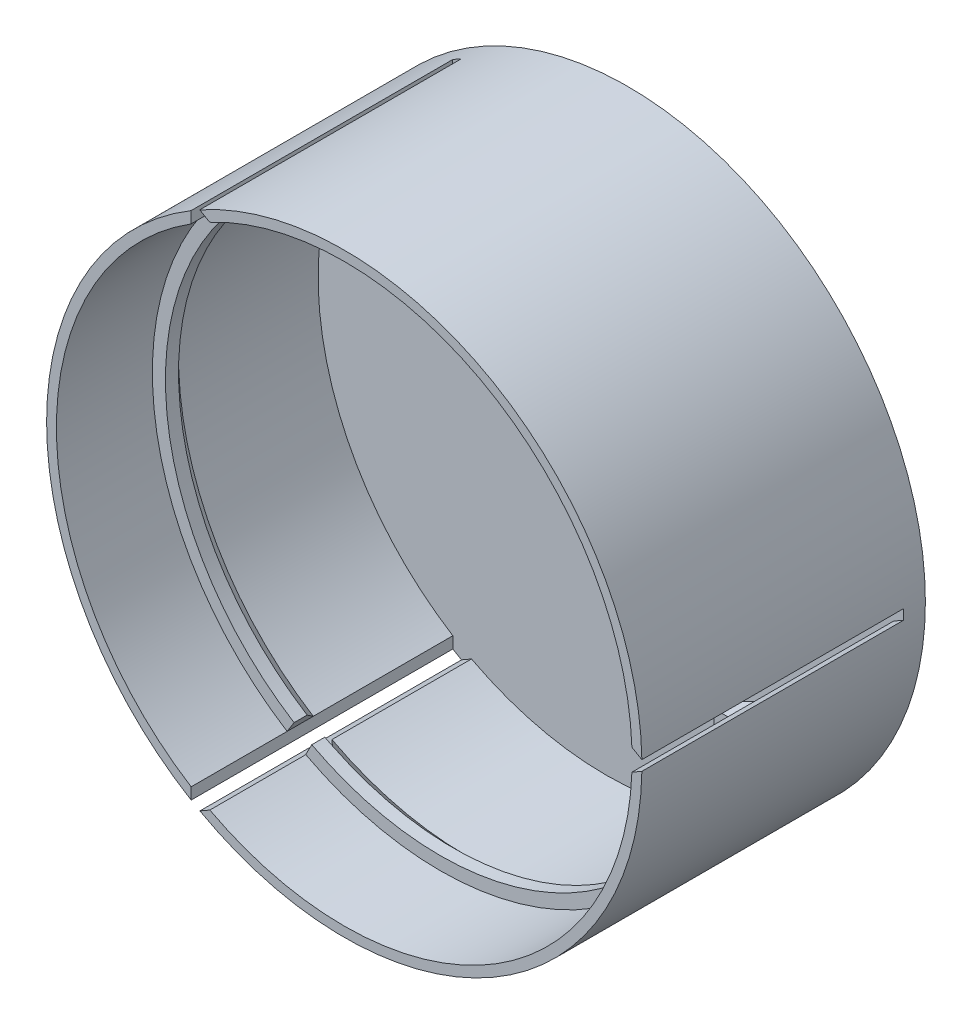
ISO-10303-21;
HEADER;
FILE_DESCRIPTION(('STEP AP214'),'2;1');
FILE_NAME('part.step','',(''),(''),'','','');
FILE_SCHEMA(('AUTOMOTIVE_DESIGN { 1 0 10303 214 1 1 1 1 }'));
ENDSEC;
DATA;
#1=APPLICATION_CONTEXT('core data for automotive mechanical design processes');
#2=APPLICATION_PROTOCOL_DEFINITION('international standard','automotive_design',2000,#1);
#3=PRODUCT_CONTEXT('',#1,'mechanical');
#4=PRODUCT('Part','Part','',(#3));
#5=PRODUCT_RELATED_PRODUCT_CATEGORY('part','',(#4));
#6=PRODUCT_DEFINITION_FORMATION('','',#4);
#7=PRODUCT_DEFINITION_CONTEXT('part definition',#1,'design');
#8=PRODUCT_DEFINITION('design','',#6,#7);
#9=PRODUCT_DEFINITION_SHAPE('','',#8);
#10=(LENGTH_UNIT() NAMED_UNIT(*) SI_UNIT(.MILLI.,.METRE.));
#11=(NAMED_UNIT(*) PLANE_ANGLE_UNIT() SI_UNIT($,.RADIAN.));
#12=(NAMED_UNIT(*) SI_UNIT($,.STERADIAN.) SOLID_ANGLE_UNIT());
#13=UNCERTAINTY_MEASURE_WITH_UNIT(LENGTH_MEASURE(1.E-05),#10,'distance_accuracy_value','');
#14=(GEOMETRIC_REPRESENTATION_CONTEXT(3) GLOBAL_UNCERTAINTY_ASSIGNED_CONTEXT((#13)) GLOBAL_UNIT_ASSIGNED_CONTEXT((#10,
#11,#12)) REPRESENTATION_CONTEXT('',''));
#15=CARTESIAN_POINT('',(0.,0.,0.));
#16=DIRECTION('',(0.,0.,1.));
#17=DIRECTION('',(1.,0.,0.));
#18=AXIS2_PLACEMENT_3D('',#15,#16,#17);
#19=CARTESIAN_POINT('',(0.,0.,-5.));
#20=DIRECTION('',(0.,0.,1.));
#21=DIRECTION('',(1.,0.,0.));
#22=AXIS2_PLACEMENT_3D('',#19,#20,#21);
#23=CYLINDRICAL_SURFACE('',#22,66.);
#24=DIRECTION('',(0.,0.,1.));
#25=VECTOR('',#24,1.);
#26=CARTESIAN_POINT('',(-30.8219729506805,-58.3609971078932,-5.));
#27=LINE('',#26,#25);
#28=CARTESIAN_POINT('',(-30.8219729506805,-58.3609971078932,-5.));
#29=VERTEX_POINT('',#28);
#30=CARTESIAN_POINT('',(-30.8219729506805,-58.3609971078932,27.));
#31=VERTEX_POINT('',#30);
#32=EDGE_CURVE('E397',#29,#31,#27,.T.);
#33=ORIENTED_EDGE('',*,*,#32,.T.);
#34=CARTESIAN_POINT('',(0.,0.,27.));
#35=DIRECTION('',(0.,0.,1.));
#36=DIRECTION('',(1.,0.,0.));
#37=AXIS2_PLACEMENT_3D('',#34,#35,#36);
#38=CIRCLE('',#37,66.);
#39=CARTESIAN_POINT('',(65.9542093795676,-2.45810193363761,27.));
#40=VERTEX_POINT('',#39);
#41=EDGE_CURVE('E465',#31,#40,#38,.T.);
#42=ORIENTED_EDGE('',*,*,#41,.T.);
#43=DIRECTION('',(0.,0.,1.));
#44=VECTOR('',#43,1.);
#45=CARTESIAN_POINT('',(65.9542093795676,-2.45810193363761,-5.));
#46=LINE('',#45,#44);
#47=CARTESIAN_POINT('',(65.9542093795676,-2.45810193363761,-5.));
#48=VERTEX_POINT('',#47);
#49=EDGE_CURVE('E391',#48,#40,#46,.T.);
#50=ORIENTED_EDGE('',*,*,#49,.F.);
#51=CARTESIAN_POINT('',(0.,0.,-5.));
#52=DIRECTION('',(0.,0.,1.));
#53=DIRECTION('',(1.,0.,0.));
#54=AXIS2_PLACEMENT_3D('',#51,#52,#53);
#55=CIRCLE('',#54,66.);
#56=EDGE_CURVE('E367',#29,#48,#55,.T.);
#57=ORIENTED_EDGE('',*,*,#56,.F.);
#58=EDGE_LOOP('',(#33,#42,#50,#57));
#59=FACE_BOUND('',#58,.T.);
#60=ADVANCED_FACE('F45',(#59),#23,.F.);
#61=CARTESIAN_POINT('',(0.,0.,-5.));
#62=DIRECTION('',(0.,0.,1.));
#63=DIRECTION('',(1.,0.,0.));
#64=AXIS2_PLACEMENT_3D('',#61,#62,#63);
#65=CYLINDRICAL_SURFACE('',#64,66.);
#66=DIRECTION('',(0.,0.,1.));
#67=VECTOR('',#66,1.);
#68=CARTESIAN_POINT('',(-35.1311196102854,55.8731101239928,-5.));
#69=LINE('',#68,#67);
#70=CARTESIAN_POINT('',(-35.1311196102854,55.8731101239928,-5.));
#71=VERTEX_POINT('',#70);
#72=CARTESIAN_POINT('',(-35.1311196102854,55.8731101239928,27.));
#73=VERTEX_POINT('',#72);
#74=EDGE_CURVE('E408',#71,#73,#69,.T.);
#75=ORIENTED_EDGE('',*,*,#74,.T.);
#76=CARTESIAN_POINT('',(0.,0.,27.));
#77=DIRECTION('',(0.,0.,1.));
#78=DIRECTION('',(1.,0.,0.));
#79=AXIS2_PLACEMENT_3D('',#76,#77,#78);
#80=CIRCLE('',#79,66.);
#81=CARTESIAN_POINT('',(-35.1058834094056,-55.8889698424047,27.));
#82=VERTEX_POINT('',#81);
#83=EDGE_CURVE('E476',#73,#82,#80,.T.);
#84=ORIENTED_EDGE('',*,*,#83,.T.);
#85=DIRECTION('',(0.,0.,1.));
#86=VECTOR('',#85,1.);
#87=CARTESIAN_POINT('',(-35.1058834094056,-55.8889698424047,-5.));
#88=LINE('',#87,#86);
#89=CARTESIAN_POINT('',(-35.1058834094056,-55.8889698424047,-5.));
#90=VERTEX_POINT('',#89);
#91=EDGE_CURVE('E403',#90,#82,#88,.T.);
#92=ORIENTED_EDGE('',*,*,#91,.F.);
#93=CARTESIAN_POINT('',(0.,0.,-5.));
#94=DIRECTION('',(0.,0.,1.));
#95=DIRECTION('',(1.,0.,0.));
#96=AXIS2_PLACEMENT_3D('',#93,#94,#95);
#97=CIRCLE('',#96,66.);
#98=EDGE_CURVE('E356',#71,#90,#97,.T.);
#99=ORIENTED_EDGE('',*,*,#98,.F.);
#100=EDGE_LOOP('',(#75,#84,#92,#99));
#101=FACE_BOUND('',#100,.T.);
#102=ADVANCED_FACE('F566',(#101),#65,.F.);
#103=CARTESIAN_POINT('',(0.,0.,-5.));
#104=DIRECTION('',(0.,0.,1.));
#105=DIRECTION('',(1.,0.,0.));
#106=AXIS2_PLACEMENT_3D('',#103,#104,#105);
#107=CYLINDRICAL_SURFACE('',#106,66.);
#108=DIRECTION('',(0.,0.,1.));
#109=VECTOR('',#108,1.);
#110=CARTESIAN_POINT('',(65.9530925609659,2.48788698390048,-5.));
#111=LINE('',#110,#109);
#112=CARTESIAN_POINT('',(65.9530925609659,2.48788698390048,-5.));
#113=VERTEX_POINT('',#112);
#114=CARTESIAN_POINT('',(65.9530925609659,2.48788698390048,27.));
#115=VERTEX_POINT('',#114);
#116=EDGE_CURVE('E417',#113,#115,#111,.T.);
#117=ORIENTED_EDGE('',*,*,#116,.T.);
#118=CARTESIAN_POINT('',(0.,0.,27.));
#119=DIRECTION('',(0.,0.,1.));
#120=DIRECTION('',(1.,0.,0.));
#121=AXIS2_PLACEMENT_3D('',#118,#119,#120);
#122=CIRCLE('',#121,66.);
#123=CARTESIAN_POINT('',(-30.848325970162,58.3470717760423,27.));
#124=VERTEX_POINT('',#123);
#125=EDGE_CURVE('E472',#115,#124,#122,.T.);
#126=ORIENTED_EDGE('',*,*,#125,.T.);
#127=DIRECTION('',(0.,0.,1.));
#128=VECTOR('',#127,1.);
#129=CARTESIAN_POINT('',(-30.848325970162,58.3470717760423,-5.));
#130=LINE('',#129,#128);
#131=CARTESIAN_POINT('',(-30.848325970162,58.3470717760423,-5.));
#132=VERTEX_POINT('',#131);
#133=EDGE_CURVE('E412',#132,#124,#130,.T.);
#134=ORIENTED_EDGE('',*,*,#133,.F.);
#135=CARTESIAN_POINT('',(0.,0.,-5.));
#136=DIRECTION('',(0.,0.,1.));
#137=DIRECTION('',(1.,0.,0.));
#138=AXIS2_PLACEMENT_3D('',#135,#136,#137);
#139=CIRCLE('',#138,66.);
#140=EDGE_CURVE('E345',#113,#132,#139,.T.);
#141=ORIENTED_EDGE('',*,*,#140,.F.);
#142=EDGE_LOOP('',(#117,#126,#134,#141));
#143=FACE_BOUND('',#142,.T.);
#144=ADVANCED_FACE('F577',(#143),#107,.F.);
#145=CARTESIAN_POINT('',(0.,0.,55.));
#146=DIRECTION('',(0.,0.,1.));
#147=DIRECTION('',(1.,0.,0.));
#148=AXIS2_PLACEMENT_3D('',#145,#146,#147);
#149=PLANE('',#148);
#150=DIRECTION('',(0.86591248026329,0.500195538289056,0.));
#151=VECTOR('',#150,1.);
#152=CARTESIAN_POINT('',(65.9542093795676,-2.45810193363761,55.));
#153=LINE('',#152,#151);
#154=CARTESIAN_POINT('',(65.9542093795676,-2.45810193363761,55.));
#155=VERTEX_POINT('',#154);
#156=CARTESIAN_POINT('',(68.2405216669806,-1.13741048806372,55.));
#157=VERTEX_POINT('',#156);
#158=EDGE_CURVE('E336',#155,#157,#153,.T.);
#159=ORIENTED_EDGE('',*,*,#158,.F.);
#160=CARTESIAN_POINT('',(0.,0.,55.));
#161=DIRECTION('',(0.,0.,1.));
#162=DIRECTION('',(1.,0.,0.));
#163=AXIS2_PLACEMENT_3D('',#160,#161,#162);
#164=CIRCLE('',#163,66.);
#165=CARTESIAN_POINT('',(-30.8219729506805,-58.3609971078932,55.));
#166=VERTEX_POINT('',#165);
#167=EDGE_CURVE('E342',#166,#155,#164,.T.);
#168=ORIENTED_EDGE('',*,*,#167,.F.);
#169=DIRECTION('',(0.865912480263289,0.500195538289057,0.));
#170=VECTOR('',#169,1.);
#171=CARTESIAN_POINT('',(17.5661182144436,-30.4095495207654,55.));
#172=LINE('',#171,#170);
#173=CARTESIAN_POINT('',(-33.1082852380935,-59.6816885534671,55.));
#174=VERTEX_POINT('',#173);
#175=EDGE_CURVE('E455',#174,#166,#172,.T.);
#176=ORIENTED_EDGE('',*,*,#175,.F.);
#177=CARTESIAN_POINT('',(0.,0.,55.));
#178=DIRECTION('',(0.,0.,1.));
#179=DIRECTION('',(1.,0.,0.));
#180=AXIS2_PLACEMENT_3D('',#177,#178,#179);
#181=CIRCLE('',#180,68.25);
#182=EDGE_CURVE('E437',#174,#157,#181,.T.);
#183=ORIENTED_EDGE('',*,*,#182,.T.);
#184=EDGE_LOOP('',(#159,#168,#176,#183));
#185=FACE_BOUND('',#184,.T.);
#186=ADVANCED_FACE('F587',(#185),#149,.T.);
#187=DIRECTION('',(0.000225802886308738,-0.999999974506528,0.));
#188=VECTOR('',#187,1.);
#189=CARTESIAN_POINT('',(-35.1058834094056,-55.8889698424047,55.));
#190=LINE('',#189,#188);
#191=CARTESIAN_POINT('',(-35.1058834094056,-55.8889698424047,55.));
#192=VERTEX_POINT('',#191);
#193=CARTESIAN_POINT('',(-35.1052872106843,-58.5293200870757,55.));
#194=VERTEX_POINT('',#193);
#195=EDGE_CURVE('E385',#192,#194,#190,.T.);
#196=ORIENTED_EDGE('',*,*,#195,.F.);
#197=CARTESIAN_POINT('',(0.,0.,55.));
#198=DIRECTION('',(0.,0.,1.));
#199=DIRECTION('',(1.,0.,0.));
#200=AXIS2_PLACEMENT_3D('',#197,#198,#199);
#201=CIRCLE('',#200,66.);
#202=CARTESIAN_POINT('',(-35.1311196102854,55.8731101239928,55.));
#203=VERTEX_POINT('',#202);
#204=EDGE_CURVE('E381',#203,#192,#201,.T.);
#205=ORIENTED_EDGE('',*,*,#204,.F.);
#206=DIRECTION('',(0.000225802886308739,-0.999999974506528,0.));
#207=VECTOR('',#206,1.);
#208=CARTESIAN_POINT('',(-35.1185015098456,-0.0079298592059206,55.));
#209=LINE('',#208,#207);
#210=CARTESIAN_POINT('',(-35.1317158090067,58.5134603686638,55.));
#211=VERTEX_POINT('',#210);
#212=EDGE_CURVE('E451',#211,#203,#209,.T.);
#213=ORIENTED_EDGE('',*,*,#212,.F.);
#214=EDGE_CURVE('E443',#211,#194,#181,.T.);
#215=ORIENTED_EDGE('',*,*,#214,.T.);
#216=EDGE_LOOP('',(#196,#205,#213,#215));
#217=FACE_BOUND('',#216,.T.);
#218=ADVANCED_FACE('F588',(#217),#149,.T.);
#219=CARTESIAN_POINT('',(0.,0.,-10.));
#220=DIRECTION('',(0.,0.,1.));
#221=DIRECTION('',(1.,0.,0.));
#222=AXIS2_PLACEMENT_3D('',#219,#220,#221);
#223=CYLINDRICAL_SURFACE('',#222,68.25);
#224=DIRECTION('',(0.,0.,1.));
#225=VECTOR('',#224,1.);
#226=CARTESIAN_POINT('',(-33.1082852380935,-59.6816885534671,-10.));
#227=LINE('',#226,#225);
#228=CARTESIAN_POINT('',(-33.1082852380935,-59.6816885534671,-5.));
#229=VERTEX_POINT('',#228);
#230=EDGE_CURVE('E431',#229,#174,#227,.T.);
#231=ORIENTED_EDGE('',*,*,#230,.F.);
#232=CARTESIAN_POINT('',(0.,0.,-5.));
#233=DIRECTION('',(0.,0.,1.));
#234=DIRECTION('',(1.,0.,0.));
#235=AXIS2_PLACEMENT_3D('',#232,#233,#234);
#236=CIRCLE('',#235,68.25);
#237=CARTESIAN_POINT('',(-35.1052872106843,-58.5293200870757,-5.));
#238=VERTEX_POINT('',#237);
#239=EDGE_CURVE('E464',#229,#238,#236,.F.);
#240=ORIENTED_EDGE('',*,*,#239,.T.);
#241=DIRECTION('',(0.,0.,1.));
#242=VECTOR('',#241,1.);
#243=CARTESIAN_POINT('',(-35.1052872106843,-58.5293200870757,-10.));
#244=LINE('',#243,#242);
#245=EDGE_CURVE('E428',#194,#238,#244,.F.);
#246=ORIENTED_EDGE('',*,*,#245,.F.);
#247=ORIENTED_EDGE('',*,*,#214,.F.);
#248=DIRECTION('',(0.,0.,1.));
#249=VECTOR('',#248,1.);
#250=CARTESIAN_POINT('',(-35.1317158090067,58.5134603686638,-10.));
#251=LINE('',#250,#249);
#252=CARTESIAN_POINT('',(-35.1317158090067,58.5134603686638,-5.));
#253=VERTEX_POINT('',#252);
#254=EDGE_CURVE('E425',#253,#211,#251,.T.);
#255=ORIENTED_EDGE('',*,*,#254,.F.);
#256=CARTESIAN_POINT('',(-33.1352344562963,59.6667305751394,-5.));
#257=VERTEX_POINT('',#256);
#258=EDGE_CURVE('E463',#253,#257,#236,.F.);
#259=ORIENTED_EDGE('',*,*,#258,.T.);
#260=DIRECTION('',(0.,0.,1.));
#261=VECTOR('',#260,1.);
#262=CARTESIAN_POINT('',(-33.1352344562963,59.6667305751394,-10.));
#263=LINE('',#262,#261);
#264=CARTESIAN_POINT('',(-33.1352344562963,59.6667305751394,55.));
#265=VERTEX_POINT('',#264);
#266=EDGE_CURVE('E422',#265,#257,#263,.F.);
#267=ORIENTED_EDGE('',*,*,#266,.F.);
#268=CARTESIAN_POINT('',(68.2400010471002,1.16822818480333,55.));
#269=VERTEX_POINT('',#268);
#270=EDGE_CURVE('E438',#269,#265,#181,.T.);
#271=ORIENTED_EDGE('',*,*,#270,.F.);
#272=DIRECTION('',(0.,0.,1.));
#273=VECTOR('',#272,1.);
#274=CARTESIAN_POINT('',(68.2400010471002,1.16822818480333,-10.));
#275=LINE('',#274,#273);
#276=CARTESIAN_POINT('',(68.2400010471002,1.16822818480332,-5.));
#277=VERTEX_POINT('',#276);
#278=EDGE_CURVE('E395',#277,#269,#275,.T.);
#279=ORIENTED_EDGE('',*,*,#278,.F.);
#280=CARTESIAN_POINT('',(68.2405216669806,-1.13741048806372,-5.));
#281=VERTEX_POINT('',#280);
#282=EDGE_CURVE('E459',#277,#281,#236,.F.);
#283=ORIENTED_EDGE('',*,*,#282,.T.);
#284=DIRECTION('',(0.,0.,1.));
#285=VECTOR('',#284,1.);
#286=CARTESIAN_POINT('',(68.2405216669806,-1.13741048806373,-10.));
#287=LINE('',#286,#285);
#288=EDGE_CURVE('E434',#157,#281,#287,.F.);
#289=ORIENTED_EDGE('',*,*,#288,.F.);
#290=ORIENTED_EDGE('',*,*,#182,.F.);
#291=EDGE_LOOP('',(#231,#240,#246,#247,#255,#259,#267,#271,#279,#283,#289,#290));
#292=FACE_BOUND('',#291,.T.);
#293=CARTESIAN_POINT('',(0.,0.,-10.));
#294=DIRECTION('',(0.,0.,1.));
#295=DIRECTION('',(1.,0.,0.));
#296=AXIS2_PLACEMENT_3D('',#293,#294,#295);
#297=CIRCLE('',#296,68.25);
#298=CARTESIAN_POINT('',(68.25,0.,-10.));
#299=VERTEX_POINT('',#298);
#300=EDGE_CURVE('E442',#299,#299,#297,.T.);
#301=ORIENTED_EDGE('',*,*,#300,.T.);
#302=EDGE_LOOP('',(#301));
#303=FACE_BOUND('',#302,.T.);
#304=ADVANCED_FACE('F509',(#292,#303),#223,.T.);
#305=CARTESIAN_POINT('',(0.,0.,-10.));
#306=DIRECTION('',(0.,0.,1.));
#307=DIRECTION('',(1.,0.,0.));
#308=AXIS2_PLACEMENT_3D('',#305,#306,#307);
#309=PLANE('',#308);
#310=ORIENTED_EDGE('',*,*,#300,.F.);
#311=EDGE_LOOP('',(#310));
#312=FACE_BOUND('',#311,.T.);
#313=ADVANCED_FACE('F585',(#312),#309,.F.);
#314=DIRECTION('',(-0.8661382831496,0.49980443621747,0.));
#315=VECTOR('',#314,1.);
#316=CARTESIAN_POINT('',(-30.848325970162,58.3470717760423,55.));
#317=LINE('',#316,#315);
#318=CARTESIAN_POINT('',(-30.848325970162,58.3470717760423,55.));
#319=VERTEX_POINT('',#318);
#320=EDGE_CURVE('E378',#319,#265,#317,.T.);
#321=ORIENTED_EDGE('',*,*,#320,.F.);
#322=CARTESIAN_POINT('',(0.,0.,55.));
#323=DIRECTION('',(0.,0.,1.));
#324=DIRECTION('',(1.,0.,0.));
#325=AXIS2_PLACEMENT_3D('',#322,#323,#324);
#326=CIRCLE('',#325,66.);
#327=CARTESIAN_POINT('',(65.9530925609659,2.48788698390048,55.));
#328=VERTEX_POINT('',#327);
#329=EDGE_CURVE('E374',#328,#319,#326,.T.);
#330=ORIENTED_EDGE('',*,*,#329,.F.);
#331=DIRECTION('',(-0.866138283149599,0.499804436217473,0.));
#332=VECTOR('',#331,1.);
#333=CARTESIAN_POINT('',(17.5523832954021,30.4174793799714,55.));
#334=LINE('',#333,#332);
#335=EDGE_CURVE('E447',#269,#328,#334,.T.);
#336=ORIENTED_EDGE('',*,*,#335,.F.);
#337=ORIENTED_EDGE('',*,*,#270,.T.);
#338=EDGE_LOOP('',(#321,#330,#336,#337));
#339=FACE_BOUND('',#338,.T.);
#340=ADVANCED_FACE('F582',(#339),#149,.T.);
#341=CARTESIAN_POINT('',(65.9542093795676,-2.45810193363761,-5.));
#342=DIRECTION('',(0.500195538289056,-0.86591248026329,0.));
#343=DIRECTION('',(0.86591248026329,0.500195538289056,0.));
#344=AXIS2_PLACEMENT_3D('',#341,#342,#343);
#345=PLANE('',#344);
#346=ORIENTED_EDGE('',*,*,#288,.T.);
#347=DIRECTION('',(0.86591248026329,0.500195538289056,0.));
#348=VECTOR('',#347,1.);
#349=CARTESIAN_POINT('',(65.9542093795676,-2.45810193363761,-5.));
#350=LINE('',#349,#348);
#351=EDGE_CURVE('E337',#48,#281,#350,.T.);
#352=ORIENTED_EDGE('',*,*,#351,.F.);
#353=ORIENTED_EDGE('',*,*,#49,.T.);
#354=DIRECTION('',(0.,0.,-1.));
#355=VECTOR('',#354,1.);
#356=CARTESIAN_POINT('',(65.9542093795676,-2.45810193363761,33.));
#357=LINE('',#356,#355);
#358=CARTESIAN_POINT('',(65.9542093795676,-2.45810193363761,33.));
#359=VERTEX_POINT('',#358);
#360=EDGE_CURVE('E244',#359,#40,#357,.T.);
#361=ORIENTED_EDGE('',*,*,#360,.F.);
#362=EDGE_CURVE('E396',#359,#155,#46,.T.);
#363=ORIENTED_EDGE('',*,*,#362,.T.);
#364=ORIENTED_EDGE('',*,*,#158,.T.);
#365=EDGE_LOOP('',(#346,#352,#353,#361,#363,#364));
#366=FACE_BOUND('',#365,.T.);
#367=ADVANCED_FACE('F551',(#366),#345,.F.);
#368=ORIENTED_EDGE('',*,*,#362,.F.);
#369=CARTESIAN_POINT('',(0.,0.,33.));
#370=DIRECTION('',(0.,0.,1.));
#371=DIRECTION('',(1.,0.,0.));
#372=AXIS2_PLACEMENT_3D('',#369,#370,#371);
#373=CIRCLE('',#372,66.);
#374=CARTESIAN_POINT('',(-30.8219729506806,-58.3609971078932,33.));
#375=VERTEX_POINT('',#374);
#376=EDGE_CURVE('E230',#375,#359,#373,.T.);
#377=ORIENTED_EDGE('',*,*,#376,.F.);
#378=EDGE_CURVE('E402',#375,#166,#27,.T.);
#379=ORIENTED_EDGE('',*,*,#378,.T.);
#380=ORIENTED_EDGE('',*,*,#167,.T.);
#381=EDGE_LOOP('',(#368,#377,#379,#380));
#382=FACE_BOUND('',#381,.T.);
#383=ADVANCED_FACE('F548',(#382),#23,.F.);
#384=CARTESIAN_POINT('',(-35.1047665908039,-60.8349587599427,-5.));
#385=DIRECTION('',(0.500195538289057,-0.865912480263289,0.));
#386=DIRECTION('',(0.865912480263289,0.500195538289057,0.));
#387=AXIS2_PLACEMENT_3D('',#384,#385,#386);
#388=PLANE('',#387);
#389=ORIENTED_EDGE('',*,*,#230,.T.);
#390=ORIENTED_EDGE('',*,*,#175,.T.);
#391=ORIENTED_EDGE('',*,*,#378,.F.);
#392=CARTESIAN_POINT('',(-30.8219729506805,-58.3609971078932,30.));
#393=VERTEX_POINT('',#392);
#394=EDGE_CURVE('E401',#393,#375,#27,.T.);
#395=ORIENTED_EDGE('',*,*,#394,.F.);
#396=DIRECTION('',(-0.865912480263289,-0.500195538289057,0.));
#397=VECTOR('',#396,1.);
#398=CARTESIAN_POINT('',(-35.1047665908039,-60.8349587599427,30.));
#399=LINE('',#398,#397);
#400=CARTESIAN_POINT('',(-27.7244222407029,-56.5716926688536,30.));
#401=VERTEX_POINT('',#400);
#402=EDGE_CURVE('E469',#401,#393,#399,.T.);
#403=ORIENTED_EDGE('',*,*,#402,.F.);
#404=CARTESIAN_POINT('',(-27.7244222407029,-56.5716926688536,30.));
#405=CARTESIAN_POINT('',(-27.9836248621913,-56.7214214205882,29.7514812333899));
#406=CARTESIAN_POINT('',(-28.2425456993128,-56.8709873991948,29.5025706679296));
#407=CARTESIAN_POINT('',(-28.7598429297806,-57.1698048577106,29.0039996660546));
#408=CARTESIAN_POINT('',(-29.0182193262945,-57.3190563394494,28.7543392340232));
#409=CARTESIAN_POINT('',(-29.5344497234988,-57.6172575402593,28.2542994230189));
#410=CARTESIAN_POINT('',(-29.7923037243934,-57.7662072594483,28.003920044327));
#411=CARTESIAN_POINT('',(-30.3075101228951,-58.0638169459955,27.5024704113316));
#412=CARTESIAN_POINT('',(-30.5648625175671,-58.2124769116584,27.2514001530063));
#413=CARTESIAN_POINT('',(-30.8219729506805,-58.3609971078932,27.));
#414=B_SPLINE_CURVE_WITH_KNOTS('',3,(#404,#405,#406,#407,#408,#409,#410,#411,#412,#413),
.UNSPECIFIED.,.F.,.F.,(4,2,2,2,4),(0.,1.1671740831421,2.33434135710061,3.50150817501488,
4.668681801875),.UNSPECIFIED.);
#415=EDGE_CURVE('E488',#401,#31,#414,.T.);
#416=ORIENTED_EDGE('',*,*,#415,.T.);
#417=ORIENTED_EDGE('',*,*,#32,.F.);
#418=DIRECTION('',(0.865912480263289,0.500195538289057,0.));
#419=VECTOR('',#418,1.);
#420=CARTESIAN_POINT('',(-35.1047665908039,-60.8349587599427,-5.));
#421=LINE('',#420,#419);
#422=EDGE_CURVE('E364',#229,#29,#421,.T.);
#423=ORIENTED_EDGE('',*,*,#422,.F.);
#424=EDGE_LOOP('',(#389,#390,#391,#395,#403,#416,#417,#423));
#425=FACE_BOUND('',#424,.T.);
#426=ADVANCED_FACE('F550',(#425),#388,.F.);
#427=CARTESIAN_POINT('',(-35.1058834094056,-55.8889698424047,-5.));
#428=DIRECTION('',(-0.999999974506528,-0.000225802886308738,0.));
#429=DIRECTION('',(0.000225802886308738,-0.999999974506528,0.));
#430=AXIS2_PLACEMENT_3D('',#427,#428,#429);
#431=PLANE('',#430);
#432=ORIENTED_EDGE('',*,*,#245,.T.);
#433=DIRECTION('',(0.000225802886308738,-0.999999974506528,0.));
#434=VECTOR('',#433,1.);
#435=CARTESIAN_POINT('',(-35.1058834094056,-55.8889698424047,-5.));
#436=LINE('',#435,#434);
#437=EDGE_CURVE('E360',#90,#238,#436,.T.);
#438=ORIENTED_EDGE('',*,*,#437,.F.);
#439=ORIENTED_EDGE('',*,*,#91,.T.);
#440=DIRECTION('',(0.,0.,-1.));
#441=VECTOR('',#440,1.);
#442=CARTESIAN_POINT('',(-35.1058834094056,-55.8889698424047,33.));
#443=LINE('',#442,#441);
#444=CARTESIAN_POINT('',(-35.1058834094056,-55.8889698424047,33.));
#445=VERTEX_POINT('',#444);
#446=EDGE_CURVE('E303',#445,#82,#443,.T.);
#447=ORIENTED_EDGE('',*,*,#446,.F.);
#448=EDGE_CURVE('E407',#445,#192,#88,.T.);
#449=ORIENTED_EDGE('',*,*,#448,.T.);
#450=ORIENTED_EDGE('',*,*,#195,.T.);
#451=EDGE_LOOP('',(#432,#438,#439,#447,#449,#450));
#452=FACE_BOUND('',#451,.T.);
#453=ADVANCED_FACE('F556',(#452),#431,.F.);
#454=ORIENTED_EDGE('',*,*,#448,.F.);
#455=CARTESIAN_POINT('',(0.,0.,33.));
#456=DIRECTION('',(0.,0.,1.));
#457=DIRECTION('',(1.,0.,0.));
#458=AXIS2_PLACEMENT_3D('',#455,#456,#457);
#459=CIRCLE('',#458,66.);
#460=CARTESIAN_POINT('',(-35.1311196102854,55.8731101239928,33.));
#461=VERTEX_POINT('',#460);
#462=EDGE_CURVE('E277',#461,#445,#459,.T.);
#463=ORIENTED_EDGE('',*,*,#462,.F.);
#464=EDGE_CURVE('E411',#461,#203,#69,.T.);
#465=ORIENTED_EDGE('',*,*,#464,.T.);
#466=ORIENTED_EDGE('',*,*,#204,.T.);
#467=EDGE_LOOP('',(#454,#463,#465,#466));
#468=FACE_BOUND('',#467,.T.);
#469=ADVANCED_FACE('F560',(#468),#65,.F.);
#470=CARTESIAN_POINT('',(-35.1322364288871,60.8190990415308,-5.));
#471=DIRECTION('',(-0.999999974506528,-0.000225802886308739,0.));
#472=DIRECTION('',(0.000225802886308739,-0.999999974506528,0.));
#473=AXIS2_PLACEMENT_3D('',#470,#471,#472);
#474=PLANE('',#473);
#475=ORIENTED_EDGE('',*,*,#254,.T.);
#476=ORIENTED_EDGE('',*,*,#212,.T.);
#477=ORIENTED_EDGE('',*,*,#464,.F.);
#478=DIRECTION('',(0.,0.,-1.));
#479=VECTOR('',#478,1.);
#480=CARTESIAN_POINT('',(-35.1311196102854,55.8731101239928,33.));
#481=LINE('',#480,#479);
#482=EDGE_CURVE('E62',#461,#73,#481,.T.);
#483=ORIENTED_EDGE('',*,*,#482,.T.);
#484=ORIENTED_EDGE('',*,*,#74,.F.);
#485=DIRECTION('',(0.000225802886308739,-0.999999974506528,0.));
#486=VECTOR('',#485,1.);
#487=CARTESIAN_POINT('',(-35.1322364288871,60.8190990415308,-5.));
#488=LINE('',#487,#486);
#489=EDGE_CURVE('E353',#253,#71,#488,.T.);
#490=ORIENTED_EDGE('',*,*,#489,.F.);
#491=EDGE_LOOP('',(#475,#476,#477,#483,#484,#490));
#492=FACE_BOUND('',#491,.T.);
#493=ADVANCED_FACE('F564',(#492),#474,.F.);
#494=CARTESIAN_POINT('',(-30.848325970162,58.3470717760423,-5.));
#495=DIRECTION('',(0.49980443621747,0.8661382831496,0.));
#496=DIRECTION('',(-0.8661382831496,0.49980443621747,0.));
#497=AXIS2_PLACEMENT_3D('',#494,#495,#496);
#498=PLANE('',#497);
#499=ORIENTED_EDGE('',*,*,#266,.T.);
#500=DIRECTION('',(-0.8661382831496,0.49980443621747,0.));
#501=VECTOR('',#500,1.);
#502=CARTESIAN_POINT('',(-30.848325970162,58.3470717760423,-5.));
#503=LINE('',#502,#501);
#504=EDGE_CURVE('E349',#132,#257,#503,.T.);
#505=ORIENTED_EDGE('',*,*,#504,.F.);
#506=ORIENTED_EDGE('',*,*,#133,.T.);
#507=DIRECTION('',(0.,0.,-1.));
#508=VECTOR('',#507,1.);
#509=CARTESIAN_POINT('',(-30.848325970162,58.3470717760423,33.));
#510=LINE('',#509,#508);
#511=CARTESIAN_POINT('',(-30.848325970162,58.3470717760423,33.));
#512=VERTEX_POINT('',#511);
#513=EDGE_CURVE('E333',#512,#124,#510,.T.);
#514=ORIENTED_EDGE('',*,*,#513,.F.);
#515=EDGE_CURVE('E416',#512,#319,#130,.T.);
#516=ORIENTED_EDGE('',*,*,#515,.T.);
#517=ORIENTED_EDGE('',*,*,#320,.T.);
#518=EDGE_LOOP('',(#499,#505,#506,#514,#516,#517));
#519=FACE_BOUND('',#518,.T.);
#520=ADVANCED_FACE('F569',(#519),#498,.F.);
#521=ORIENTED_EDGE('',*,*,#515,.F.);
#522=CARTESIAN_POINT('',(0.,0.,33.));
#523=DIRECTION('',(0.,0.,1.));
#524=DIRECTION('',(1.,0.,0.));
#525=AXIS2_PLACEMENT_3D('',#522,#523,#524);
#526=CIRCLE('',#525,66.);
#527=CARTESIAN_POINT('',(65.9530925609659,2.48788698390048,33.));
#528=VERTEX_POINT('',#527);
#529=EDGE_CURVE('E307',#528,#512,#526,.T.);
#530=ORIENTED_EDGE('',*,*,#529,.F.);
#531=EDGE_CURVE('E371',#528,#328,#111,.T.);
#532=ORIENTED_EDGE('',*,*,#531,.T.);
#533=ORIENTED_EDGE('',*,*,#329,.T.);
#534=EDGE_LOOP('',(#521,#530,#532,#533));
#535=FACE_BOUND('',#534,.T.);
#536=ADVANCED_FACE('F572',(#535),#107,.F.);
#537=CARTESIAN_POINT('',(70.2370030196911,0.0158597184119298,-5.));
#538=DIRECTION('',(0.499804436217473,0.866138283149599,0.));
#539=DIRECTION('',(-0.866138283149599,0.499804436217473,0.));
#540=AXIS2_PLACEMENT_3D('',#537,#538,#539);
#541=PLANE('',#540);
#542=ORIENTED_EDGE('',*,*,#278,.T.);
#543=ORIENTED_EDGE('',*,*,#335,.T.);
#544=ORIENTED_EDGE('',*,*,#531,.F.);
#545=DIRECTION('',(0.,0.,-1.));
#546=VECTOR('',#545,1.);
#547=CARTESIAN_POINT('',(65.9530925609659,2.48788698390048,33.));
#548=LINE('',#547,#546);
#549=EDGE_CURVE('E71',#528,#115,#548,.T.);
#550=ORIENTED_EDGE('',*,*,#549,.T.);
#551=ORIENTED_EDGE('',*,*,#116,.F.);
#552=DIRECTION('',(-0.866138283149598,0.499804436217473,0.));
#553=VECTOR('',#552,1.);
#554=CARTESIAN_POINT('',(70.2370030196911,0.0158597184119298,-5.));
#555=LINE('',#554,#553);
#556=EDGE_CURVE('E341',#277,#113,#555,.T.);
#557=ORIENTED_EDGE('',*,*,#556,.F.);
#558=EDGE_LOOP('',(#542,#543,#544,#550,#551,#557));
#559=FACE_BOUND('',#558,.T.);
#560=ADVANCED_FACE('F546',(#559),#541,.F.);
#561=CARTESIAN_POINT('',(0.,0.,-5.));
#562=DIRECTION('',(0.,0.,1.));
#563=DIRECTION('',(1.,0.,0.));
#564=AXIS2_PLACEMENT_3D('',#561,#562,#563);
#565=PLANE('',#564);
#566=ORIENTED_EDGE('',*,*,#422,.T.);
#567=ORIENTED_EDGE('',*,*,#56,.T.);
#568=ORIENTED_EDGE('',*,*,#351,.T.);
#569=ORIENTED_EDGE('',*,*,#282,.F.);
#570=ORIENTED_EDGE('',*,*,#556,.T.);
#571=ORIENTED_EDGE('',*,*,#140,.T.);
#572=ORIENTED_EDGE('',*,*,#504,.T.);
#573=ORIENTED_EDGE('',*,*,#258,.F.);
#574=ORIENTED_EDGE('',*,*,#489,.T.);
#575=ORIENTED_EDGE('',*,*,#98,.T.);
#576=ORIENTED_EDGE('',*,*,#437,.T.);
#577=ORIENTED_EDGE('',*,*,#239,.F.);
#578=EDGE_LOOP('',(#566,#567,#568,#569,#570,#571,#572,#573,#574,#575,#576,#577));
#579=FACE_BOUND('',#578,.T.);
#580=ADVANCED_FACE('F542',(#579),#565,.T.);
#581=CARTESIAN_POINT('',(-30.848325970162,58.3470717760423,33.));
#582=DIRECTION('',(0.884046542061247,0.467398878335787,0.));
#583=DIRECTION('',(-0.467398878335787,0.884046542061247,0.));
#584=AXIS2_PLACEMENT_3D('',#581,#582,#583);
#585=PLANE('',#584);
#586=ORIENTED_EDGE('',*,*,#513,.T.);
#587=DIRECTION('',(0.330500916390221,-0.625115304776027,0.707106781186547));
#588=VECTOR('',#587,1.);
#589=CARTESIAN_POINT('',(0.,0.,92.9999999999999));
#590=LINE('',#589,#588);
#591=CARTESIAN_POINT('',(-29.4461293351547,55.6949321498585,30.));
#592=VERTEX_POINT('',#591);
#593=EDGE_CURVE('E526',#124,#592,#590,.T.);
#594=ORIENTED_EDGE('',*,*,#593,.T.);
#595=DIRECTION('',(0.,0.,-1.));
#596=VECTOR('',#595,1.);
#597=CARTESIAN_POINT('',(-29.4461293351547,55.6949321498585,33.));
#598=LINE('',#597,#596);
#599=CARTESIAN_POINT('',(-29.4461293351547,55.6949321498585,33.));
#600=VERTEX_POINT('',#599);
#601=EDGE_CURVE('E329',#600,#592,#598,.T.);
#602=ORIENTED_EDGE('',*,*,#601,.F.);
#603=DIRECTION('',(0.467398878335787,-0.884046542061247,0.));
#604=VECTOR('',#603,1.);
#605=CARTESIAN_POINT('',(-30.848325970162,58.3470717760423,33.));
#606=LINE('',#605,#604);
#607=EDGE_CURVE('E311',#512,#600,#606,.T.);
#608=ORIENTED_EDGE('',*,*,#607,.F.);
#609=EDGE_LOOP('',(#586,#594,#602,#608));
#610=FACE_BOUND('',#609,.T.);
#611=ADVANCED_FACE('F538',(#610),#585,.F.);
#612=CARTESIAN_POINT('',(0.,0.,33.));
#613=DIRECTION('',(0.,0.,-1.));
#614=DIRECTION('',(-1.,0.,0.));
#615=AXIS2_PLACEMENT_3D('',#612,#613,#614);
#616=CYLINDRICAL_SURFACE('',#615,63.);
#617=CARTESIAN_POINT('',(0.,0.,30.));
#618=DIRECTION('',(0.,0.,-1.));
#619=DIRECTION('',(1.,0.,0.));
#620=AXIS2_PLACEMENT_3D('',#617,#618,#619);
#621=CIRCLE('',#620,63.);
#622=CARTESIAN_POINT('',(62.9508571693455,2.48788698390048,30.));
#623=VERTEX_POINT('',#622);
#624=EDGE_CURVE('E306',#592,#623,#621,.T.);
#625=ORIENTED_EDGE('',*,*,#624,.T.);
#626=DIRECTION('',(0.,0.,-1.));
#627=VECTOR('',#626,1.);
#628=CARTESIAN_POINT('',(62.9508571693455,2.48788698390048,33.));
#629=LINE('',#628,#627);
#630=CARTESIAN_POINT('',(62.9508571693455,2.48788698390048,33.));
#631=VERTEX_POINT('',#630);
#632=EDGE_CURVE('E325',#631,#623,#629,.T.);
#633=ORIENTED_EDGE('',*,*,#632,.F.);
#634=CARTESIAN_POINT('',(0.,0.,33.));
#635=DIRECTION('',(0.,0.,-1.));
#636=DIRECTION('',(1.,0.,0.));
#637=AXIS2_PLACEMENT_3D('',#634,#635,#636);
#638=CIRCLE('',#637,63.);
#639=EDGE_CURVE('E314',#600,#631,#638,.T.);
#640=ORIENTED_EDGE('',*,*,#639,.F.);
#641=ORIENTED_EDGE('',*,*,#601,.T.);
#642=EDGE_LOOP('',(#625,#633,#640,#641));
#643=FACE_BOUND('',#642,.T.);
#644=ADVANCED_FACE('F533',(#643),#616,.F.);
#645=CARTESIAN_POINT('',(65.9530925609659,2.48788698390048,33.));
#646=DIRECTION('',(0.,1.,0.));
#647=DIRECTION('',(-1.,0.,0.));
#648=AXIS2_PLACEMENT_3D('',#645,#646,#647);
#649=PLANE('',#648);
#650=ORIENTED_EDGE('',*,*,#632,.T.);
#651=CARTESIAN_POINT('',(62.9508571693455,2.48788698390048,30.));
#652=CARTESIAN_POINT('',(63.4512384021507,2.48788698390048,29.5000086739918));
#653=CARTESIAN_POINT('',(63.9516153011887,2.48788698390048,29.0000130109872));
#654=CARTESIAN_POINT('',(64.9523604317289,2.48788698390048,28.0000130109873));
#655=CARTESIAN_POINT('',(65.452728663231,2.48788698390048,27.5000086739918));
#656=CARTESIAN_POINT('',(65.9530925609659,2.48788698390048,27.));
#657=B_SPLINE_CURVE_WITH_KNOTS('',3,(#651,#652,#653,#654,#655,#656),.UNSPECIFIED.,.F.,.F.,(4,2,
4),(0.,2.12211082109974,4.24422164219206),.UNSPECIFIED.);
#658=EDGE_CURVE('E518',#623,#115,#657,.T.);
#659=ORIENTED_EDGE('',*,*,#658,.T.);
#660=ORIENTED_EDGE('',*,*,#549,.F.);
#661=DIRECTION('',(1.,0.,0.));
#662=VECTOR('',#661,1.);
#663=CARTESIAN_POINT('',(65.9530925609659,2.48788698390048,33.));
#664=LINE('',#663,#662);
#665=EDGE_CURVE('E317',#631,#528,#664,.T.);
#666=ORIENTED_EDGE('',*,*,#665,.F.);
#667=EDGE_LOOP('',(#650,#659,#660,#666));
#668=FACE_BOUND('',#667,.T.);
#669=ADVANCED_FACE('F527',(#668),#649,.F.);
#670=CARTESIAN_POINT('',(0.,0.,33.));
#671=DIRECTION('',(0.,0.,1.));
#672=DIRECTION('',(1.,0.,0.));
#673=AXIS2_PLACEMENT_3D('',#670,#671,#672);
#674=PLANE('',#673);
#675=ORIENTED_EDGE('',*,*,#529,.T.);
#676=ORIENTED_EDGE('',*,*,#607,.T.);
#677=ORIENTED_EDGE('',*,*,#639,.T.);
#678=ORIENTED_EDGE('',*,*,#665,.T.);
#679=EDGE_LOOP('',(#675,#676,#677,#678));
#680=FACE_BOUND('',#679,.T.);
#681=ADVANCED_FACE('F532',(#680),#674,.T.);
#682=CARTESIAN_POINT('',(-35.1058834094056,-55.8889698424047,33.));
#683=DIRECTION('',(-0.846802573369767,0.531907324384935,0.));
#684=DIRECTION('',(-0.531907324384935,-0.846802573369767,0.));
#685=AXIS2_PLACEMENT_3D('',#682,#683,#684);
#686=PLANE('',#685);
#687=ORIENTED_EDGE('',*,*,#446,.T.);
#688=DIRECTION('',(0.37611527603538,0.598779841955982,0.707106781186547));
#689=VECTOR('',#688,1.);
#690=CARTESIAN_POINT('',(0.,0.,92.9999999999999));
#691=LINE('',#690,#689);
#692=CARTESIAN_POINT('',(-33.5101614362508,-53.3485621222953,30.));
#693=VERTEX_POINT('',#692);
#694=EDGE_CURVE('E55',#82,#693,#691,.T.);
#695=ORIENTED_EDGE('',*,*,#694,.T.);
#696=DIRECTION('',(0.,0.,-1.));
#697=VECTOR('',#696,1.);
#698=CARTESIAN_POINT('',(-33.5101614362508,-53.3485621222953,33.));
#699=LINE('',#698,#697);
#700=CARTESIAN_POINT('',(-33.5101614362508,-53.3485621222953,33.));
#701=VERTEX_POINT('',#700);
#702=EDGE_CURVE('E299',#701,#693,#699,.T.);
#703=ORIENTED_EDGE('',*,*,#702,.F.);
#704=DIRECTION('',(0.531907324384935,0.846802573369767,0.));
#705=VECTOR('',#704,1.);
#706=CARTESIAN_POINT('',(-35.1058834094056,-55.8889698424047,33.));
#707=LINE('',#706,#705);
#708=EDGE_CURVE('E281',#445,#701,#707,.T.);
#709=ORIENTED_EDGE('',*,*,#708,.F.);
#710=EDGE_LOOP('',(#687,#695,#703,#709));
#711=FACE_BOUND('',#710,.T.);
#712=ADVANCED_FACE('F701',(#711),#686,.F.);
#713=CARTESIAN_POINT('',(0.,0.,33.));
#714=DIRECTION('',(0.,0.,-1.));
#715=DIRECTION('',(-1.,0.,0.));
#716=AXIS2_PLACEMENT_3D('',#713,#714,#715);
#717=CYLINDRICAL_SURFACE('',#716,63.);
#718=CARTESIAN_POINT('',(0.,0.,30.));
#719=DIRECTION('',(0.,0.,-1.));
#720=DIRECTION('',(1.,0.,0.));
#721=AXIS2_PLACEMENT_3D('',#718,#719,#720);
#722=CIRCLE('',#721,63.);
#723=CARTESIAN_POINT('',(-33.5342505370906,53.3334233001749,30.));
#724=VERTEX_POINT('',#723);
#725=EDGE_CURVE('E276',#693,#724,#722,.T.);
#726=ORIENTED_EDGE('',*,*,#725,.T.);
#727=DIRECTION('',(0.,0.,-1.));
#728=VECTOR('',#727,1.);
#729=CARTESIAN_POINT('',(-33.5342505370906,53.3334233001749,33.));
#730=LINE('',#729,#728);
#731=CARTESIAN_POINT('',(-33.5342505370906,53.3334233001749,33.));
#732=VERTEX_POINT('',#731);
#733=EDGE_CURVE('E295',#732,#724,#730,.T.);
#734=ORIENTED_EDGE('',*,*,#733,.F.);
#735=CARTESIAN_POINT('',(0.,0.,33.));
#736=DIRECTION('',(0.,0.,-1.));
#737=DIRECTION('',(1.,0.,0.));
#738=AXIS2_PLACEMENT_3D('',#735,#736,#737);
#739=CIRCLE('',#738,63.);
#740=EDGE_CURVE('E284',#701,#732,#739,.T.);
#741=ORIENTED_EDGE('',*,*,#740,.F.);
#742=ORIENTED_EDGE('',*,*,#702,.T.);
#743=EDGE_LOOP('',(#726,#734,#741,#742));
#744=FACE_BOUND('',#743,.T.);
#745=ADVANCED_FACE('F699',(#744),#717,.F.);
#746=CARTESIAN_POINT('',(-35.1311196102854,55.8731101239928,33.));
#747=DIRECTION('',(-0.84656227460595,-0.532289691064932,0.));
#748=DIRECTION('',(0.532289691064932,-0.84656227460595,0.));
#749=AXIS2_PLACEMENT_3D('',#746,#747,#748);
#750=PLANE('',#749);
#751=ORIENTED_EDGE('',*,*,#733,.T.);
#752=DIRECTION('',(-0.376385650107706,0.598609925070576,-0.707106781186547));
#753=VECTOR('',#752,1.);
#754=CARTESIAN_POINT('',(1.05735704517739E-13,0.,92.9999999999999));
#755=LINE('',#754,#753);
#756=EDGE_CURVE('E13',#724,#73,#755,.T.);
#757=ORIENTED_EDGE('',*,*,#756,.T.);
#758=ORIENTED_EDGE('',*,*,#482,.F.);
#759=DIRECTION('',(-0.532289691064932,0.84656227460595,0.));
#760=VECTOR('',#759,1.);
#761=CARTESIAN_POINT('',(-35.1311196102854,55.8731101239928,33.));
#762=LINE('',#761,#760);
#763=EDGE_CURVE('E287',#732,#461,#762,.T.);
#764=ORIENTED_EDGE('',*,*,#763,.F.);
#765=EDGE_LOOP('',(#751,#757,#758,#764));
#766=FACE_BOUND('',#765,.T.);
#767=ADVANCED_FACE('F697',(#766),#750,.F.);
#768=CARTESIAN_POINT('',(0.,0.,33.));
#769=DIRECTION('',(0.,0.,1.));
#770=DIRECTION('',(1.,0.,0.));
#771=AXIS2_PLACEMENT_3D('',#768,#769,#770);
#772=PLANE('',#771);
#773=ORIENTED_EDGE('',*,*,#462,.T.);
#774=ORIENTED_EDGE('',*,*,#708,.T.);
#775=ORIENTED_EDGE('',*,*,#740,.T.);
#776=ORIENTED_EDGE('',*,*,#763,.T.);
#777=EDGE_LOOP('',(#773,#774,#775,#776));
#778=FACE_BOUND('',#777,.T.);
#779=ADVANCED_FACE('F693',(#778),#772,.T.);
#780=CARTESIAN_POINT('',(0.,0.,33.));
#781=DIRECTION('',(0.,0.,-1.));
#782=DIRECTION('',(-1.,0.,0.));
#783=AXIS2_PLACEMENT_3D('',#780,#781,#782);
#784=CYLINDRICAL_SURFACE('',#783,66.);
#785=CARTESIAN_POINT('',(0.,0.,30.));
#786=DIRECTION('',(0.,0.,1.));
#787=DIRECTION('',(1.,0.,0.));
#788=AXIS2_PLACEMENT_3D('',#785,#786,#787);
#789=CIRCLE('',#788,66.);
#790=CARTESIAN_POINT('',(-30.848325970162,-58.3470717760423,30.));
#791=VERTEX_POINT('',#790);
#792=EDGE_CURVE('E258',#791,#393,#789,.T.);
#793=ORIENTED_EDGE('',*,*,#792,.T.);
#794=ORIENTED_EDGE('',*,*,#394,.T.);
#795=CARTESIAN_POINT('',(-30.848325970162,-58.3470717760423,33.));
#796=VERTEX_POINT('',#795);
#797=EDGE_CURVE('E233',#796,#375,#373,.T.);
#798=ORIENTED_EDGE('',*,*,#797,.F.);
#799=DIRECTION('',(0.,0.,-1.));
#800=VECTOR('',#799,1.);
#801=CARTESIAN_POINT('',(-30.848325970162,-58.3470717760423,33.));
#802=LINE('',#801,#800);
#803=EDGE_CURVE('E254',#796,#791,#802,.T.);
#804=ORIENTED_EDGE('',*,*,#803,.T.);
#805=EDGE_LOOP('',(#793,#794,#798,#804));
#806=FACE_BOUND('',#805,.T.);
#807=ADVANCED_FACE('F618',(#806),#784,.T.);
#808=CARTESIAN_POINT('',(65.9542093795676,-2.45810193363761,33.));
#809=DIRECTION('',(0.,-1.,0.));
#810=DIRECTION('',(1.,0.,0.));
#811=AXIS2_PLACEMENT_3D('',#808,#809,#810);
#812=PLANE('',#811);
#813=ORIENTED_EDGE('',*,*,#360,.T.);
#814=CARTESIAN_POINT('',(65.9542093795676,-2.45810193363761,27.));
#815=CARTESIAN_POINT('',(65.4538541522464,-2.45810193363761,27.5000084670938));
#816=CARTESIAN_POINT('',(64.9534946944549,-2.45810193363761,28.0000127006403));
#817=CARTESIAN_POINT('',(63.95276731793,-2.45810193363761,29.0000127006403));
#818=CARTESIAN_POINT('',(63.4523993991965,-2.45810193363761,29.5000084670938));
#819=CARTESIAN_POINT('',(62.9520272499929,-2.45810193363761,30.));
#820=B_SPLINE_CURVE_WITH_KNOTS('',3,(#814,#815,#816,#817,#818,#819),.UNSPECIFIED.,.F.,.F.,(4,2,
4),(0.,2.12209198318354,4.24418396637416),.UNSPECIFIED.);
#821=CARTESIAN_POINT('',(62.9520272499929,-2.45810193363761,30.));
#822=VERTEX_POINT('',#821);
#823=EDGE_CURVE('E239',#40,#822,#820,.T.);
#824=ORIENTED_EDGE('',*,*,#823,.T.);
#825=DIRECTION('',(0.,0.,-1.));
#826=VECTOR('',#825,1.);
#827=CARTESIAN_POINT('',(62.9520272499929,-2.45810193363761,33.));
#828=LINE('',#827,#826);
#829=CARTESIAN_POINT('',(62.9520272499929,-2.45810193363761,33.));
#830=VERTEX_POINT('',#829);
#831=EDGE_CURVE('E236',#830,#822,#828,.T.);
#832=ORIENTED_EDGE('',*,*,#831,.F.);
#833=DIRECTION('',(-1.,0.,0.));
#834=VECTOR('',#833,1.);
#835=CARTESIAN_POINT('',(65.9542093795676,-2.45810193363761,33.));
#836=LINE('',#835,#834);
#837=EDGE_CURVE('E222',#359,#830,#836,.T.);
#838=ORIENTED_EDGE('',*,*,#837,.F.);
#839=EDGE_LOOP('',(#813,#824,#832,#838));
#840=FACE_BOUND('',#839,.T.);
#841=ADVANCED_FACE('F237',(#840),#812,.F.);
#842=CARTESIAN_POINT('',(0.,0.,33.));
#843=DIRECTION('',(0.,0.,-1.));
#844=DIRECTION('',(-1.,0.,0.));
#845=AXIS2_PLACEMENT_3D('',#842,#843,#844);
#846=CYLINDRICAL_SURFACE('',#845,63.);
#847=CARTESIAN_POINT('',(0.,0.,30.));
#848=DIRECTION('',(0.,0.,-1.));
#849=DIRECTION('',(1.,0.,0.));
#850=AXIS2_PLACEMENT_3D('',#847,#848,#849);
#851=CIRCLE('',#850,63.);
#852=EDGE_CURVE('E263',#822,#401,#851,.T.);
#853=ORIENTED_EDGE('',*,*,#852,.T.);
#854=CARTESIAN_POINT('',(-29.4461293351547,-55.6949321498585,30.));
#855=VERTEX_POINT('',#854);
#856=EDGE_CURVE('E262',#401,#855,#851,.T.);
#857=ORIENTED_EDGE('',*,*,#856,.T.);
#858=DIRECTION('',(0.,0.,-1.));
#859=VECTOR('',#858,1.);
#860=CARTESIAN_POINT('',(-29.4461293351547,-55.6949321498585,33.));
#861=LINE('',#860,#859);
#862=CARTESIAN_POINT('',(-29.4461293351547,-55.6949321498585,33.));
#863=VERTEX_POINT('',#862);
#864=EDGE_CURVE('E245',#863,#855,#861,.T.);
#865=ORIENTED_EDGE('',*,*,#864,.F.);
#866=CARTESIAN_POINT('',(0.,0.,33.));
#867=DIRECTION('',(0.,0.,-1.));
#868=DIRECTION('',(1.,0.,0.));
#869=AXIS2_PLACEMENT_3D('',#866,#867,#868);
#870=CIRCLE('',#869,63.);
#871=EDGE_CURVE('E227',#830,#863,#870,.T.);
#872=ORIENTED_EDGE('',*,*,#871,.F.);
#873=ORIENTED_EDGE('',*,*,#831,.T.);
#874=EDGE_LOOP('',(#853,#857,#865,#872,#873));
#875=FACE_BOUND('',#874,.T.);
#876=ADVANCED_FACE('F247',(#875),#846,.F.);
#877=CARTESIAN_POINT('',(-30.848325970162,-58.3470717760423,33.));
#878=DIRECTION('',(0.884046542061247,-0.467398878335787,0.));
#879=DIRECTION('',(0.467398878335787,0.884046542061247,0.));
#880=AXIS2_PLACEMENT_3D('',#877,#878,#879);
#881=PLANE('',#880);
#882=DIRECTION('',(-0.467398878335787,-0.884046542061247,0.));
#883=VECTOR('',#882,1.);
#884=CARTESIAN_POINT('',(-30.848325970162,-58.3470717760423,30.));
#885=LINE('',#884,#883);
#886=EDGE_CURVE('E266',#855,#791,#885,.T.);
#887=ORIENTED_EDGE('',*,*,#886,.T.);
#888=ORIENTED_EDGE('',*,*,#803,.F.);
#889=DIRECTION('',(-0.467398878335787,-0.884046542061247,0.));
#890=VECTOR('',#889,1.);
#891=CARTESIAN_POINT('',(-30.848325970162,-58.3470717760423,33.));
#892=LINE('',#891,#890);
#893=EDGE_CURVE('E251',#863,#796,#892,.T.);
#894=ORIENTED_EDGE('',*,*,#893,.F.);
#895=ORIENTED_EDGE('',*,*,#864,.T.);
#896=EDGE_LOOP('',(#887,#888,#894,#895));
#897=FACE_BOUND('',#896,.T.);
#898=ADVANCED_FACE('F612',(#897),#881,.F.);
#899=CARTESIAN_POINT('',(0.,0.,33.));
#900=DIRECTION('',(0.,0.,1.));
#901=DIRECTION('',(1.,0.,0.));
#902=AXIS2_PLACEMENT_3D('',#899,#900,#901);
#903=PLANE('',#902);
#904=ORIENTED_EDGE('',*,*,#797,.T.);
#905=ORIENTED_EDGE('',*,*,#376,.T.);
#906=ORIENTED_EDGE('',*,*,#837,.T.);
#907=ORIENTED_EDGE('',*,*,#871,.T.);
#908=ORIENTED_EDGE('',*,*,#893,.T.);
#909=EDGE_LOOP('',(#904,#905,#906,#907,#908));
#910=FACE_BOUND('',#909,.T.);
#911=ADVANCED_FACE('F225',(#910),#903,.T.);
#912=CARTESIAN_POINT('',(0.,0.,30.));
#913=DIRECTION('',(0.,0.,1.));
#914=DIRECTION('',(1.,0.,0.));
#915=AXIS2_PLACEMENT_3D('',#912,#913,#914);
#916=PLANE('',#915);
#917=ORIENTED_EDGE('',*,*,#856,.F.);
#918=ORIENTED_EDGE('',*,*,#402,.T.);
#919=ORIENTED_EDGE('',*,*,#792,.F.);
#920=ORIENTED_EDGE('',*,*,#886,.F.);
#921=EDGE_LOOP('',(#917,#918,#919,#920));
#922=FACE_BOUND('',#921,.T.);
#923=ADVANCED_FACE('F507',(#922),#916,.F.);
#924=CARTESIAN_POINT('',(0.,0.,27.));
#925=DIRECTION('',(0.,0.,-1.));
#926=DIRECTION('',(-1.,0.,0.));
#927=AXIS2_PLACEMENT_3D('',#924,#925,#926);
#928=CONICAL_SURFACE('',#927,66.,0.78539816339745);
#929=ORIENTED_EDGE('',*,*,#415,.F.);
#930=ORIENTED_EDGE('',*,*,#852,.F.);
#931=ORIENTED_EDGE('',*,*,#823,.F.);
#932=ORIENTED_EDGE('',*,*,#41,.F.);
#933=EDGE_LOOP('',(#929,#930,#931,#932));
#934=FACE_BOUND('',#933,.T.);
#935=ADVANCED_FACE('F499',(#934),#928,.F.);
#936=CARTESIAN_POINT('',(0.,0.,27.));
#937=DIRECTION('',(0.,0.,-1.));
#938=DIRECTION('',(-1.,0.,0.));
#939=AXIS2_PLACEMENT_3D('',#936,#937,#938);
#940=CONICAL_SURFACE('',#939,66.,0.78539816339745);
#941=ORIENTED_EDGE('',*,*,#658,.F.);
#942=ORIENTED_EDGE('',*,*,#624,.F.);
#943=ORIENTED_EDGE('',*,*,#593,.F.);
#944=ORIENTED_EDGE('',*,*,#125,.F.);
#945=EDGE_LOOP('',(#941,#942,#943,#944));
#946=FACE_BOUND('',#945,.T.);
#947=ADVANCED_FACE('F506',(#946),#940,.F.);
#948=CARTESIAN_POINT('',(0.,0.,27.));
#949=DIRECTION('',(0.,0.,-1.));
#950=DIRECTION('',(-1.,0.,0.));
#951=AXIS2_PLACEMENT_3D('',#948,#949,#950);
#952=CONICAL_SURFACE('',#951,66.,0.78539816339745);
#953=ORIENTED_EDGE('',*,*,#756,.F.);
#954=ORIENTED_EDGE('',*,*,#725,.F.);
#955=ORIENTED_EDGE('',*,*,#694,.F.);
#956=ORIENTED_EDGE('',*,*,#83,.F.);
#957=EDGE_LOOP('',(#953,#954,#955,#956));
#958=FACE_BOUND('',#957,.T.);
#959=ADVANCED_FACE('F48',(#958),#952,.F.);
#960=CLOSED_SHELL('',(#60,#102,#144,#186,#218,#304,#313,#340,#367,#383,#426,#453,#469,#493,#520,
#536,#560,#580,#611,#644,#669,#681,#712,#745,#767,#779,#807,#841,#876,#898,#911,#923,#935,#947,#959));
#961=MANIFOLD_SOLID_BREP('B2',#960);
#962=ADVANCED_BREP_SHAPE_REPRESENTATION('',(#18,#961),#14);
#963=SHAPE_DEFINITION_REPRESENTATION(#9,#962);
ENDSEC;
END-ISO-10303-21;
